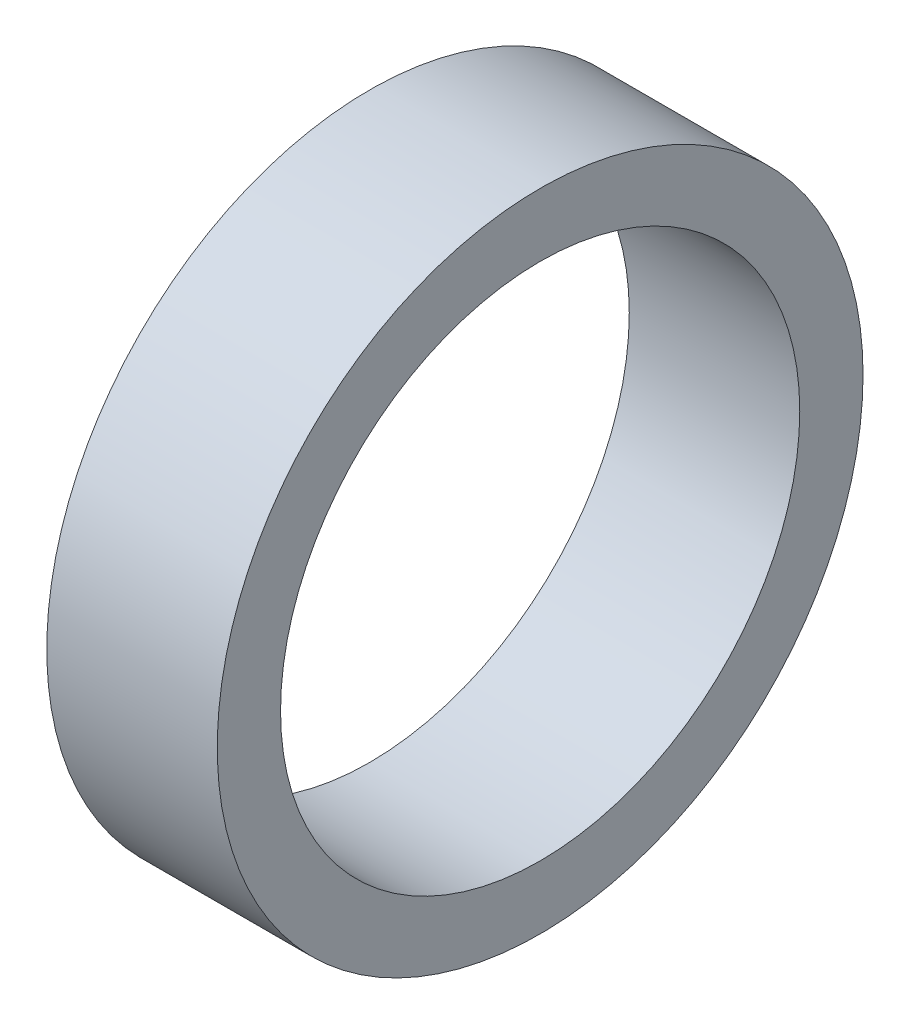
ISO-10303-21;
HEADER;
FILE_DESCRIPTION(('STEP AP214'),'2;1');
FILE_NAME('part.step','',(''),(''),'','','');
FILE_SCHEMA(('AUTOMOTIVE_DESIGN { 1 0 10303 214 1 1 1 1 }'));
ENDSEC;
DATA;
#1=APPLICATION_CONTEXT('core data for automotive mechanical design processes');
#2=APPLICATION_PROTOCOL_DEFINITION('international standard','automotive_design',2000,#1);
#3=PRODUCT_CONTEXT('',#1,'mechanical');
#4=PRODUCT('Part','Part','',(#3));
#5=PRODUCT_RELATED_PRODUCT_CATEGORY('part','',(#4));
#6=PRODUCT_DEFINITION_FORMATION('','',#4);
#7=PRODUCT_DEFINITION_CONTEXT('part definition',#1,'design');
#8=PRODUCT_DEFINITION('design','',#6,#7);
#9=PRODUCT_DEFINITION_SHAPE('','',#8);
#10=(LENGTH_UNIT() NAMED_UNIT(*) SI_UNIT(.MILLI.,.METRE.));
#11=(NAMED_UNIT(*) PLANE_ANGLE_UNIT() SI_UNIT($,.RADIAN.));
#12=(NAMED_UNIT(*) SI_UNIT($,.STERADIAN.) SOLID_ANGLE_UNIT());
#13=UNCERTAINTY_MEASURE_WITH_UNIT(LENGTH_MEASURE(1.E-05),#10,'distance_accuracy_value','');
#14=(GEOMETRIC_REPRESENTATION_CONTEXT(3) GLOBAL_UNCERTAINTY_ASSIGNED_CONTEXT((#13)) GLOBAL_UNIT_ASSIGNED_CONTEXT((#10,
#11,#12)) REPRESENTATION_CONTEXT('',''));
#15=CARTESIAN_POINT('',(0.,0.,0.));
#16=DIRECTION('',(0.,0.,1.));
#17=DIRECTION('',(1.,0.,0.));
#18=AXIS2_PLACEMENT_3D('',#15,#16,#17);
#19=CARTESIAN_POINT('',(8.382,0.,0.));
#20=DIRECTION('',(-1.,0.,0.));
#21=DIRECTION('',(0.,0.,1.));
#22=AXIS2_PLACEMENT_3D('',#19,#20,#21);
#23=CYLINDRICAL_SURFACE('',#22,15.875);
#24=CARTESIAN_POINT('',(8.382,0.,0.));
#25=DIRECTION('',(1.,0.,0.));
#26=DIRECTION('',(0.,0.,-1.));
#27=AXIS2_PLACEMENT_3D('',#24,#25,#26);
#28=CIRCLE('',#27,15.875);
#29=CARTESIAN_POINT('',(8.382,0.,-15.875));
#30=VERTEX_POINT('',#29);
#31=EDGE_CURVE('E10',#30,#30,#28,.T.);
#32=ORIENTED_EDGE('',*,*,#31,.F.);
#33=EDGE_LOOP('',(#32));
#34=FACE_BOUND('',#33,.T.);
#35=CARTESIAN_POINT('',(0.,0.,0.));
#36=DIRECTION('',(1.,0.,0.));
#37=DIRECTION('',(0.,0.,-1.));
#38=AXIS2_PLACEMENT_3D('',#35,#36,#37);
#39=CIRCLE('',#38,15.875);
#40=CARTESIAN_POINT('',(0.,0.,-15.875));
#41=VERTEX_POINT('',#40);
#42=EDGE_CURVE('E33',#41,#41,#39,.T.);
#43=ORIENTED_EDGE('',*,*,#42,.T.);
#44=EDGE_LOOP('',(#43));
#45=FACE_BOUND('',#44,.T.);
#46=ADVANCED_FACE('F30',(#34,#45),#23,.T.);
#47=CARTESIAN_POINT('',(8.382,0.,0.));
#48=DIRECTION('',(1.,0.,0.));
#49=DIRECTION('',(0.,0.,-1.));
#50=AXIS2_PLACEMENT_3D('',#47,#48,#49);
#51=PLANE('',#50);
#52=CARTESIAN_POINT('',(8.382,0.,0.));
#53=DIRECTION('',(1.,0.,0.));
#54=DIRECTION('',(0.,0.,-1.));
#55=AXIS2_PLACEMENT_3D('',#52,#53,#54);
#56=CIRCLE('',#55,12.7635);
#57=CARTESIAN_POINT('',(8.382,0.,-12.7635));
#58=VERTEX_POINT('',#57);
#59=EDGE_CURVE('E44',#58,#58,#56,.T.);
#60=ORIENTED_EDGE('',*,*,#59,.F.);
#61=EDGE_LOOP('',(#60));
#62=FACE_BOUND('',#61,.T.);
#63=ORIENTED_EDGE('',*,*,#31,.T.);
#64=EDGE_LOOP('',(#63));
#65=FACE_BOUND('',#64,.T.);
#66=ADVANCED_FACE('F51',(#62,#65),#51,.T.);
#67=CARTESIAN_POINT('',(0.,0.,0.));
#68=DIRECTION('',(1.,0.,0.));
#69=DIRECTION('',(0.,0.,-1.));
#70=AXIS2_PLACEMENT_3D('',#67,#68,#69);
#71=PLANE('',#70);
#72=CARTESIAN_POINT('',(0.,0.,0.));
#73=DIRECTION('',(1.,0.,0.));
#74=DIRECTION('',(0.,0.,-1.));
#75=AXIS2_PLACEMENT_3D('',#72,#73,#74);
#76=CIRCLE('',#75,12.7635);
#77=CARTESIAN_POINT('',(0.,0.,-12.7635));
#78=VERTEX_POINT('',#77);
#79=EDGE_CURVE('E40',#78,#78,#76,.F.);
#80=ORIENTED_EDGE('',*,*,#79,.F.);
#81=EDGE_LOOP('',(#80));
#82=FACE_BOUND('',#81,.T.);
#83=ORIENTED_EDGE('',*,*,#42,.F.);
#84=EDGE_LOOP('',(#83));
#85=FACE_BOUND('',#84,.T.);
#86=ADVANCED_FACE('F53',(#82,#85),#71,.F.);
#87=CARTESIAN_POINT('',(-0.00100000000002876,0.,0.));
#88=DIRECTION('',(1.,0.,0.));
#89=DIRECTION('',(0.,0.,-1.));
#90=AXIS2_PLACEMENT_3D('',#87,#88,#89);
#91=CYLINDRICAL_SURFACE('',#90,12.7635);
#92=ORIENTED_EDGE('',*,*,#59,.T.);
#93=EDGE_LOOP('',(#92));
#94=FACE_BOUND('',#93,.T.);
#95=ORIENTED_EDGE('',*,*,#79,.T.);
#96=EDGE_LOOP('',(#95));
#97=FACE_BOUND('',#96,.T.);
#98=ADVANCED_FACE('F48',(#94,#97),#91,.F.);
#99=CLOSED_SHELL('',(#46,#66,#86,#98));
#100=MANIFOLD_SOLID_BREP('B2',#99);
#101=ADVANCED_BREP_SHAPE_REPRESENTATION('',(#18,#100),#14);
#102=SHAPE_DEFINITION_REPRESENTATION(#9,#101);
ENDSEC;
END-ISO-10303-21;
